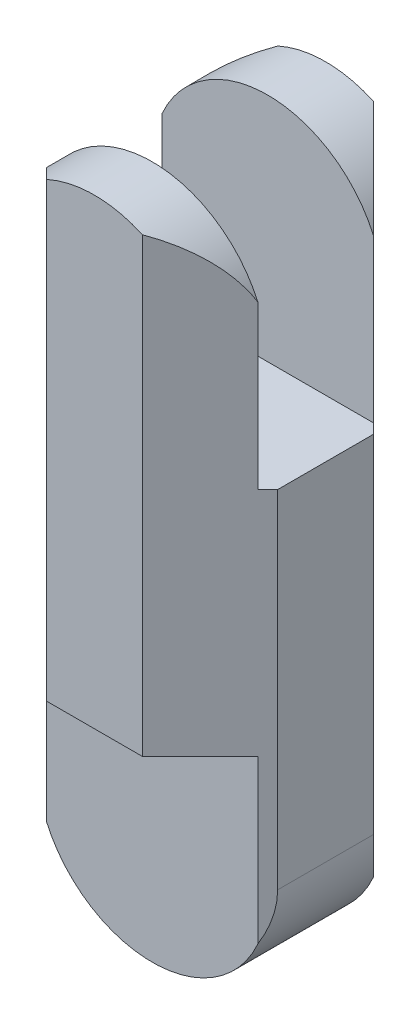
ISO-10303-21;
HEADER;
FILE_DESCRIPTION(('STEP AP214'),'2;1');
FILE_NAME('part.step','',(''),(''),'','','');
FILE_SCHEMA(('AUTOMOTIVE_DESIGN { 1 0 10303 214 1 1 1 1 }'));
ENDSEC;
DATA;
#1=APPLICATION_CONTEXT('core data for automotive mechanical design processes');
#2=APPLICATION_PROTOCOL_DEFINITION('international standard','automotive_design',2000,#1);
#3=PRODUCT_CONTEXT('',#1,'mechanical');
#4=PRODUCT('Part','Part','',(#3));
#5=PRODUCT_RELATED_PRODUCT_CATEGORY('part','',(#4));
#6=PRODUCT_DEFINITION_FORMATION('','',#4);
#7=PRODUCT_DEFINITION_CONTEXT('part definition',#1,'design');
#8=PRODUCT_DEFINITION('design','',#6,#7);
#9=PRODUCT_DEFINITION_SHAPE('','',#8);
#10=(LENGTH_UNIT() NAMED_UNIT(*) SI_UNIT(.MILLI.,.METRE.));
#11=(NAMED_UNIT(*) PLANE_ANGLE_UNIT() SI_UNIT($,.RADIAN.));
#12=(NAMED_UNIT(*) SI_UNIT($,.STERADIAN.) SOLID_ANGLE_UNIT());
#13=UNCERTAINTY_MEASURE_WITH_UNIT(LENGTH_MEASURE(1.E-05),#10,'distance_accuracy_value','');
#14=(GEOMETRIC_REPRESENTATION_CONTEXT(3) GLOBAL_UNCERTAINTY_ASSIGNED_CONTEXT((#13)) GLOBAL_UNIT_ASSIGNED_CONTEXT((#10,
#11,#12)) REPRESENTATION_CONTEXT('',''));
#15=CARTESIAN_POINT('',(0.,0.,0.));
#16=DIRECTION('',(0.,0.,1.));
#17=DIRECTION('',(1.,0.,0.));
#18=AXIS2_PLACEMENT_3D('',#15,#16,#17);
#19=CARTESIAN_POINT('',(4.14213562373094,60.,-10.));
#20=DIRECTION('',(0.,0.,1.));
#21=DIRECTION('',(1.,0.,0.));
#22=AXIS2_PLACEMENT_3D('',#19,#20,#21);
#23=PLANE('',#22);
#24=DIRECTION('',(0.,-1.,0.));
#25=VECTOR('',#24,1.);
#26=CARTESIAN_POINT('',(-4.14213562373096,60.,-10.));
#27=LINE('',#26,#25);
#28=CARTESIAN_POINT('',(-4.14213562373096,59.1017972112445,-10.));
#29=VERTEX_POINT('',#28);
#30=CARTESIAN_POINT('',(-4.14213562373096,20.,-10.));
#31=VERTEX_POINT('',#30);
#32=EDGE_CURVE('E186',#29,#31,#27,.T.);
#33=ORIENTED_EDGE('',*,*,#32,.F.);
#34=CARTESIAN_POINT('',(0.,50.,-10.));
#35=DIRECTION('',(0.,0.,1.));
#36=DIRECTION('',(1.,0.,0.));
#37=AXIS2_PLACEMENT_3D('',#34,#35,#36);
#38=CIRCLE('',#37,10.);
#39=CARTESIAN_POINT('',(4.14213562373094,59.1017972112446,-10.));
#40=VERTEX_POINT('',#39);
#41=EDGE_CURVE('E343',#29,#40,#38,.F.);
#42=ORIENTED_EDGE('',*,*,#41,.T.);
#43=DIRECTION('',(0.,-1.,0.));
#44=VECTOR('',#43,1.);
#45=CARTESIAN_POINT('',(4.14213562373094,60.,-10.));
#46=LINE('',#45,#44);
#47=CARTESIAN_POINT('',(4.14213562373094,20.,-10.));
#48=VERTEX_POINT('',#47);
#49=EDGE_CURVE('E189',#40,#48,#46,.T.);
#50=ORIENTED_EDGE('',*,*,#49,.T.);
#51=DIRECTION('',(1.,0.,0.));
#52=VECTOR('',#51,1.);
#53=CARTESIAN_POINT('',(10.,20.,-10.));
#54=LINE('',#53,#52);
#55=EDGE_CURVE('E261',#31,#48,#54,.T.);
#56=ORIENTED_EDGE('',*,*,#55,.F.);
#57=EDGE_LOOP('',(#33,#42,#50,#56));
#58=FACE_BOUND('',#57,.T.);
#59=ADVANCED_FACE('F39',(#58),#23,.F.);
#60=CARTESIAN_POINT('',(-4.14213562373096,60.,10.));
#61=DIRECTION('',(0.,0.,-1.));
#62=DIRECTION('',(-1.,0.,0.));
#63=AXIS2_PLACEMENT_3D('',#60,#61,#62);
#64=PLANE('',#63);
#65=DIRECTION('',(0.,-1.,0.));
#66=VECTOR('',#65,1.);
#67=CARTESIAN_POINT('',(4.14213562373096,60.,10.));
#68=LINE('',#67,#66);
#69=CARTESIAN_POINT('',(4.14213562373096,59.1017972112445,10.));
#70=VERTEX_POINT('',#69);
#71=CARTESIAN_POINT('',(4.14213562373096,20.,10.));
#72=VERTEX_POINT('',#71);
#73=EDGE_CURVE('E166',#70,#72,#68,.T.);
#74=ORIENTED_EDGE('',*,*,#73,.F.);
#75=CARTESIAN_POINT('',(0.,50.,10.));
#76=DIRECTION('',(0.,0.,-1.));
#77=DIRECTION('',(1.,0.,0.));
#78=AXIS2_PLACEMENT_3D('',#75,#76,#77);
#79=CIRCLE('',#78,10.);
#80=CARTESIAN_POINT('',(-4.14213562373096,59.1017972112445,10.));
#81=VERTEX_POINT('',#80);
#82=EDGE_CURVE('E153',#81,#70,#79,.T.);
#83=ORIENTED_EDGE('',*,*,#82,.F.);
#84=DIRECTION('',(0.,-1.,0.));
#85=VECTOR('',#84,1.);
#86=CARTESIAN_POINT('',(-4.14213562373096,60.,10.));
#87=LINE('',#86,#85);
#88=CARTESIAN_POINT('',(-4.14213562373096,20.,10.));
#89=VERTEX_POINT('',#88);
#90=EDGE_CURVE('E164',#81,#89,#87,.T.);
#91=ORIENTED_EDGE('',*,*,#90,.T.);
#92=DIRECTION('',(-1.,0.,0.));
#93=VECTOR('',#92,1.);
#94=CARTESIAN_POINT('',(-10.,20.,10.));
#95=LINE('',#94,#93);
#96=EDGE_CURVE('E278',#72,#89,#95,.T.);
#97=ORIENTED_EDGE('',*,*,#96,.F.);
#98=EDGE_LOOP('',(#74,#83,#91,#97));
#99=FACE_BOUND('',#98,.T.);
#100=ADVANCED_FACE('F162',(#99),#64,.F.);
#101=CARTESIAN_POINT('',(10.,60.,-4.14213562373095));
#102=DIRECTION('',(-0.707106781186547,0.,0.707106781186548));
#103=DIRECTION('',(0.707106781186548,0.,0.707106781186547));
#104=AXIS2_PLACEMENT_3D('',#101,#102,#103);
#105=PLANE('',#104);
#106=ORIENTED_EDGE('',*,*,#49,.F.);
#107=CARTESIAN_POINT('',(0.,50.,-14.1421356237309));
#108=DIRECTION('',(-0.707106781186547,0.,0.707106781186548));
#109=DIRECTION('',(0.707106781186548,0.,0.707106781186547));
#110=AXIS2_PLACEMENT_3D('',#107,#108,#109);
#111=ELLIPSE('',#110,14.1421356237309,10.);
#112=CARTESIAN_POINT('',(9.14213562373095,54.0523272618718,-5.));
#113=VERTEX_POINT('',#112);
#114=EDGE_CURVE('E339',#40,#113,#111,.F.);
#115=ORIENTED_EDGE('',*,*,#114,.T.);
#116=DIRECTION('',(0.,1.,0.));
#117=VECTOR('',#116,1.);
#118=CARTESIAN_POINT('',(9.14213562373095,60.,-5.));
#119=LINE('',#118,#117);
#120=CARTESIAN_POINT('',(9.14213562373095,40.,-5.));
#121=VERTEX_POINT('',#120);
#122=EDGE_CURVE('E246',#121,#113,#119,.T.);
#123=ORIENTED_EDGE('',*,*,#122,.F.);
#124=DIRECTION('',(0.707106781186548,0.,0.707106781186547));
#125=VECTOR('',#124,1.);
#126=CARTESIAN_POINT('',(10.,40.,-4.14213562373095));
#127=LINE('',#126,#125);
#128=CARTESIAN_POINT('',(10.,40.,-4.14213562373095));
#129=VERTEX_POINT('',#128);
#130=EDGE_CURVE('E258',#121,#129,#127,.T.);
#131=ORIENTED_EDGE('',*,*,#130,.T.);
#132=DIRECTION('',(0.,-1.,0.));
#133=VECTOR('',#132,1.);
#134=CARTESIAN_POINT('',(10.,60.,-4.14213562373095));
#135=LINE('',#134,#133);
#136=CARTESIAN_POINT('',(10.,10.,-4.14213562373095));
#137=VERTEX_POINT('',#136);
#138=EDGE_CURVE('E192',#129,#137,#135,.T.);
#139=ORIENTED_EDGE('',*,*,#138,.T.);
#140=CARTESIAN_POINT('',(0.,10.,-14.1421356237309));
#141=DIRECTION('',(-0.707106781186547,0.,0.707106781186548));
#142=DIRECTION('',(0.707106781186548,0.,0.707106781186547));
#143=AXIS2_PLACEMENT_3D('',#140,#141,#142);
#144=ELLIPSE('',#143,14.1421356237309,10.);
#145=CARTESIAN_POINT('',(9.14213562373095,5.94767273812816,-5.00000000000001));
#146=VERTEX_POINT('',#145);
#147=EDGE_CURVE('E312',#137,#146,#144,.F.);
#148=ORIENTED_EDGE('',*,*,#147,.T.);
#149=DIRECTION('',(0.,-1.,0.));
#150=VECTOR('',#149,1.);
#151=CARTESIAN_POINT('',(9.14213562373095,60.,-5.00000000000001));
#152=LINE('',#151,#150);
#153=CARTESIAN_POINT('',(9.14213562373095,20.,-5.00000000000001));
#154=VERTEX_POINT('',#153);
#155=EDGE_CURVE('E268',#154,#146,#152,.T.);
#156=ORIENTED_EDGE('',*,*,#155,.F.);
#157=DIRECTION('',(-0.707106781186548,0.,-0.707106781186547));
#158=VECTOR('',#157,1.);
#159=CARTESIAN_POINT('',(10.,20.,-4.14213562373095));
#160=LINE('',#159,#158);
#161=EDGE_CURVE('E274',#154,#48,#160,.T.);
#162=ORIENTED_EDGE('',*,*,#161,.T.);
#163=EDGE_LOOP('',(#106,#115,#123,#131,#139,#148,#156,#162));
#164=FACE_BOUND('',#163,.T.);
#165=ADVANCED_FACE('F320',(#164),#105,.F.);
#166=CARTESIAN_POINT('',(-4.14213562373096,60.,-10.));
#167=DIRECTION('',(0.707106781186548,0.,0.707106781186547));
#168=DIRECTION('',(0.707106781186547,0.,-0.707106781186548));
#169=AXIS2_PLACEMENT_3D('',#166,#167,#168);
#170=PLANE('',#169);
#171=DIRECTION('',(0.,-1.,0.));
#172=VECTOR('',#171,1.);
#173=CARTESIAN_POINT('',(-9.14213562373095,60.,-5.));
#174=LINE('',#173,#172);
#175=CARTESIAN_POINT('',(-9.14213562373095,54.0523272618718,-5.));
#176=VERTEX_POINT('',#175);
#177=CARTESIAN_POINT('',(-9.14213562373095,40.,-5.));
#178=VERTEX_POINT('',#177);
#179=EDGE_CURVE('E243',#176,#178,#174,.T.);
#180=ORIENTED_EDGE('',*,*,#179,.F.);
#181=CARTESIAN_POINT('',(0.,50.,-14.142135623731));
#182=DIRECTION('',(0.707106781186548,0.,0.707106781186547));
#183=DIRECTION('',(-0.707106781186547,0.,0.707106781186548));
#184=AXIS2_PLACEMENT_3D('',#181,#182,#183);
#185=ELLIPSE('',#184,14.142135623731,10.);
#186=EDGE_CURVE('E350',#176,#29,#185,.F.);
#187=ORIENTED_EDGE('',*,*,#186,.T.);
#188=ORIENTED_EDGE('',*,*,#32,.T.);
#189=DIRECTION('',(-0.707106781186547,0.,0.707106781186548));
#190=VECTOR('',#189,1.);
#191=CARTESIAN_POINT('',(-4.14213562373096,20.,-10.));
#192=LINE('',#191,#190);
#193=CARTESIAN_POINT('',(-9.14213562373096,20.,-5.));
#194=VERTEX_POINT('',#193);
#195=EDGE_CURVE('E205',#31,#194,#192,.T.);
#196=ORIENTED_EDGE('',*,*,#195,.T.);
#197=DIRECTION('',(0.,1.,0.));
#198=VECTOR('',#197,1.);
#199=CARTESIAN_POINT('',(-9.14213562373096,60.,-5.));
#200=LINE('',#199,#198);
#201=CARTESIAN_POINT('',(-9.14213562373096,5.94767273812821,-5.));
#202=VERTEX_POINT('',#201);
#203=EDGE_CURVE('E202',#202,#194,#200,.T.);
#204=ORIENTED_EDGE('',*,*,#203,.F.);
#205=CARTESIAN_POINT('',(0.,10.,-14.142135623731));
#206=DIRECTION('',(0.707106781186548,0.,0.707106781186547));
#207=DIRECTION('',(-0.707106781186547,0.,0.707106781186548));
#208=AXIS2_PLACEMENT_3D('',#205,#206,#207);
#209=ELLIPSE('',#208,14.142135623731,10.);
#210=CARTESIAN_POINT('',(-10.,10.,-4.14213562373095));
#211=VERTEX_POINT('',#210);
#212=EDGE_CURVE('E298',#202,#211,#209,.F.);
#213=ORIENTED_EDGE('',*,*,#212,.T.);
#214=DIRECTION('',(0.,-1.,0.));
#215=VECTOR('',#214,1.);
#216=CARTESIAN_POINT('',(-10.,60.,-4.14213562373095));
#217=LINE('',#216,#215);
#218=CARTESIAN_POINT('',(-10.,40.,-4.14213562373096));
#219=VERTEX_POINT('',#218);
#220=EDGE_CURVE('E178',#219,#211,#217,.T.);
#221=ORIENTED_EDGE('',*,*,#220,.F.);
#222=DIRECTION('',(0.707106781186547,0.,-0.707106781186548));
#223=VECTOR('',#222,1.);
#224=CARTESIAN_POINT('',(-4.14213562373096,40.,-10.));
#225=LINE('',#224,#223);
#226=EDGE_CURVE('E254',#219,#178,#225,.T.);
#227=ORIENTED_EDGE('',*,*,#226,.T.);
#228=EDGE_LOOP('',(#180,#187,#188,#196,#204,#213,#221,#227));
#229=FACE_BOUND('',#228,.T.);
#230=ADVANCED_FACE('F330',(#229),#170,.F.);
#231=CARTESIAN_POINT('',(0.,0.,-5.));
#232=DIRECTION('',(0.,0.,1.));
#233=DIRECTION('',(1.,0.,0.));
#234=AXIS2_PLACEMENT_3D('',#231,#232,#233);
#235=PLANE('',#234);
#236=CARTESIAN_POINT('',(0.,50.,-5.));
#237=DIRECTION('',(0.,0.,1.));
#238=DIRECTION('',(1.,0.,0.));
#239=AXIS2_PLACEMENT_3D('',#236,#237,#238);
#240=CIRCLE('',#239,10.);
#241=EDGE_CURVE('E158',#176,#113,#240,.F.);
#242=ORIENTED_EDGE('',*,*,#241,.F.);
#243=ORIENTED_EDGE('',*,*,#179,.T.);
#244=DIRECTION('',(1.,0.,0.));
#245=VECTOR('',#244,1.);
#246=CARTESIAN_POINT('',(-10.,40.,-5.));
#247=LINE('',#246,#245);
#248=EDGE_CURVE('E236',#178,#121,#247,.T.);
#249=ORIENTED_EDGE('',*,*,#248,.T.);
#250=ORIENTED_EDGE('',*,*,#122,.T.);
#251=EDGE_LOOP('',(#242,#243,#249,#250));
#252=FACE_BOUND('',#251,.T.);
#253=ADVANCED_FACE('F357',(#252),#235,.T.);
#254=CARTESIAN_POINT('',(0.,0.,5.));
#255=DIRECTION('',(0.,0.,1.));
#256=DIRECTION('',(1.,0.,0.));
#257=AXIS2_PLACEMENT_3D('',#254,#255,#256);
#258=PLANE('',#257);
#259=DIRECTION('',(0.,-1.,0.));
#260=VECTOR('',#259,1.);
#261=CARTESIAN_POINT('',(-9.14213562373096,60.,5.));
#262=LINE('',#261,#260);
#263=CARTESIAN_POINT('',(-9.14213562373096,54.0523272618718,5.));
#264=VERTEX_POINT('',#263);
#265=CARTESIAN_POINT('',(-9.14213562373096,40.,5.));
#266=VERTEX_POINT('',#265);
#267=EDGE_CURVE('E234',#264,#266,#262,.T.);
#268=ORIENTED_EDGE('',*,*,#267,.F.);
#269=CARTESIAN_POINT('',(0.,50.,5.));
#270=DIRECTION('',(0.,0.,1.));
#271=DIRECTION('',(1.,0.,0.));
#272=AXIS2_PLACEMENT_3D('',#269,#270,#271);
#273=CIRCLE('',#272,10.);
#274=CARTESIAN_POINT('',(9.14213562373096,54.0523272618718,5.));
#275=VERTEX_POINT('',#274);
#276=EDGE_CURVE('E11',#264,#275,#273,.F.);
#277=ORIENTED_EDGE('',*,*,#276,.T.);
#278=DIRECTION('',(0.,1.,0.));
#279=VECTOR('',#278,1.);
#280=CARTESIAN_POINT('',(9.14213562373096,60.,5.));
#281=LINE('',#280,#279);
#282=CARTESIAN_POINT('',(9.14213562373096,40.,5.));
#283=VERTEX_POINT('',#282);
#284=EDGE_CURVE('E214',#283,#275,#281,.T.);
#285=ORIENTED_EDGE('',*,*,#284,.F.);
#286=DIRECTION('',(1.,0.,0.));
#287=VECTOR('',#286,1.);
#288=CARTESIAN_POINT('',(-10.,40.,5.));
#289=LINE('',#288,#287);
#290=EDGE_CURVE('E225',#266,#283,#289,.T.);
#291=ORIENTED_EDGE('',*,*,#290,.F.);
#292=EDGE_LOOP('',(#268,#277,#285,#291));
#293=FACE_BOUND('',#292,.T.);
#294=ADVANCED_FACE('F376',(#293),#258,.F.);
#295=CARTESIAN_POINT('',(0.,10.,-56.));
#296=DIRECTION('',(0.,0.,1.));
#297=DIRECTION('',(1.,0.,0.));
#298=AXIS2_PLACEMENT_3D('',#295,#296,#297);
#299=CYLINDRICAL_SURFACE('',#298,10.);
#300=CARTESIAN_POINT('',(0.,10.,-5.));
#301=DIRECTION('',(0.,0.,-1.));
#302=DIRECTION('',(-1.,0.,0.));
#303=AXIS2_PLACEMENT_3D('',#300,#301,#302);
#304=CIRCLE('',#303,10.);
#305=EDGE_CURVE('E62',#146,#202,#304,.T.);
#306=ORIENTED_EDGE('',*,*,#305,.F.);
#307=ORIENTED_EDGE('',*,*,#147,.F.);
#308=DIRECTION('',(0.,0.,1.));
#309=VECTOR('',#308,1.);
#310=CARTESIAN_POINT('',(10.,10.,-56.));
#311=LINE('',#310,#309);
#312=CARTESIAN_POINT('',(10.,9.99999999999999,4.14213562373095));
#313=VERTEX_POINT('',#312);
#314=EDGE_CURVE('E294',#137,#313,#311,.T.);
#315=ORIENTED_EDGE('',*,*,#314,.T.);
#316=CARTESIAN_POINT('',(0.,10.,14.1421356237309));
#317=DIRECTION('',(-0.707106781186547,0.,-0.707106781186548));
#318=DIRECTION('',(-0.707106781186548,0.,0.707106781186547));
#319=AXIS2_PLACEMENT_3D('',#316,#317,#318);
#320=ELLIPSE('',#319,14.1421356237309,10.);
#321=CARTESIAN_POINT('',(9.14213562373095,5.94767273812818,5.));
#322=VERTEX_POINT('',#321);
#323=EDGE_CURVE('E305',#322,#313,#320,.F.);
#324=ORIENTED_EDGE('',*,*,#323,.F.);
#325=CARTESIAN_POINT('',(0.,10.,5.));
#326=DIRECTION('',(0.,0.,1.));
#327=DIRECTION('',(1.,0.,0.));
#328=AXIS2_PLACEMENT_3D('',#325,#326,#327);
#329=CIRCLE('',#328,10.);
#330=CARTESIAN_POINT('',(-9.14213562373095,5.94767273812819,5.00000000000001));
#331=VERTEX_POINT('',#330);
#332=EDGE_CURVE('E195',#331,#322,#329,.T.);
#333=ORIENTED_EDGE('',*,*,#332,.F.);
#334=CARTESIAN_POINT('',(0.,10.,14.142135623731));
#335=DIRECTION('',(0.707106781186548,0.,-0.707106781186547));
#336=DIRECTION('',(0.707106781186547,0.,0.707106781186548));
#337=AXIS2_PLACEMENT_3D('',#334,#335,#336);
#338=ELLIPSE('',#337,14.142135623731,10.);
#339=CARTESIAN_POINT('',(-10.,10.,4.14213562373096));
#340=VERTEX_POINT('',#339);
#341=EDGE_CURVE('E308',#340,#331,#338,.F.);
#342=ORIENTED_EDGE('',*,*,#341,.F.);
#343=DIRECTION('',(0.,0.,1.));
#344=VECTOR('',#343,1.);
#345=CARTESIAN_POINT('',(-10.,10.,-56.));
#346=LINE('',#345,#344);
#347=EDGE_CURVE('E293',#211,#340,#346,.T.);
#348=ORIENTED_EDGE('',*,*,#347,.F.);
#349=ORIENTED_EDGE('',*,*,#212,.F.);
#350=EDGE_LOOP('',(#306,#307,#315,#324,#333,#342,#348,#349));
#351=FACE_BOUND('',#350,.T.);
#352=ADVANCED_FACE('F322',(#351),#299,.T.);
#353=CARTESIAN_POINT('',(-10.,60.,-4.14213562373095));
#354=DIRECTION('',(1.,0.,0.));
#355=DIRECTION('',(0.,0.,-1.));
#356=AXIS2_PLACEMENT_3D('',#353,#354,#355);
#357=PLANE('',#356);
#358=DIRECTION('',(0.,-1.,0.));
#359=VECTOR('',#358,1.);
#360=CARTESIAN_POINT('',(-10.,60.,4.14213562373096));
#361=LINE('',#360,#359);
#362=CARTESIAN_POINT('',(-10.,40.,4.14213562373096));
#363=VERTEX_POINT('',#362);
#364=EDGE_CURVE('E174',#363,#340,#361,.T.);
#365=ORIENTED_EDGE('',*,*,#364,.F.);
#366=DIRECTION('',(0.,0.,1.));
#367=VECTOR('',#366,1.);
#368=CARTESIAN_POINT('',(-10.,40.,-5.));
#369=LINE('',#368,#367);
#370=EDGE_CURVE('E230',#219,#363,#369,.T.);
#371=ORIENTED_EDGE('',*,*,#370,.F.);
#372=ORIENTED_EDGE('',*,*,#220,.T.);
#373=ORIENTED_EDGE('',*,*,#347,.T.);
#374=EDGE_LOOP('',(#365,#371,#372,#373));
#375=FACE_BOUND('',#374,.T.);
#376=ADVANCED_FACE('F374',(#375),#357,.F.);
#377=CARTESIAN_POINT('',(10.,60.,4.14213562373095));
#378=DIRECTION('',(-1.,0.,0.));
#379=DIRECTION('',(0.,0.,1.));
#380=AXIS2_PLACEMENT_3D('',#377,#378,#379);
#381=PLANE('',#380);
#382=ORIENTED_EDGE('',*,*,#138,.F.);
#383=DIRECTION('',(0.,0.,1.));
#384=VECTOR('',#383,1.);
#385=CARTESIAN_POINT('',(10.,40.,-5.));
#386=LINE('',#385,#384);
#387=CARTESIAN_POINT('',(10.,40.,4.14213562373096));
#388=VERTEX_POINT('',#387);
#389=EDGE_CURVE('E221',#129,#388,#386,.T.);
#390=ORIENTED_EDGE('',*,*,#389,.T.);
#391=DIRECTION('',(0.,-1.,0.));
#392=VECTOR('',#391,1.);
#393=CARTESIAN_POINT('',(10.,60.,4.14213562373095));
#394=LINE('',#393,#392);
#395=EDGE_CURVE('E180',#388,#313,#394,.T.);
#396=ORIENTED_EDGE('',*,*,#395,.T.);
#397=ORIENTED_EDGE('',*,*,#314,.F.);
#398=EDGE_LOOP('',(#382,#390,#396,#397));
#399=FACE_BOUND('',#398,.T.);
#400=ADVANCED_FACE('F41',(#399),#381,.F.);
#401=CARTESIAN_POINT('',(-10.,60.,4.14213562373096));
#402=DIRECTION('',(0.707106781186548,0.,-0.707106781186547));
#403=DIRECTION('',(-0.707106781186547,0.,-0.707106781186548));
#404=AXIS2_PLACEMENT_3D('',#401,#402,#403);
#405=PLANE('',#404);
#406=ORIENTED_EDGE('',*,*,#90,.F.);
#407=CARTESIAN_POINT('',(0.,50.,14.142135623731));
#408=DIRECTION('',(0.707106781186548,0.,-0.707106781186547));
#409=DIRECTION('',(0.707106781186547,0.,0.707106781186548));
#410=AXIS2_PLACEMENT_3D('',#407,#408,#409);
#411=ELLIPSE('',#410,14.142135623731,10.);
#412=EDGE_CURVE('E150',#81,#264,#411,.F.);
#413=ORIENTED_EDGE('',*,*,#412,.T.);
#414=ORIENTED_EDGE('',*,*,#267,.T.);
#415=DIRECTION('',(-0.707106781186547,0.,-0.707106781186548));
#416=VECTOR('',#415,1.);
#417=CARTESIAN_POINT('',(-10.,40.,4.14213562373096));
#418=LINE('',#417,#416);
#419=EDGE_CURVE('E250',#266,#363,#418,.T.);
#420=ORIENTED_EDGE('',*,*,#419,.T.);
#421=ORIENTED_EDGE('',*,*,#364,.T.);
#422=ORIENTED_EDGE('',*,*,#341,.T.);
#423=DIRECTION('',(0.,-1.,0.));
#424=VECTOR('',#423,1.);
#425=CARTESIAN_POINT('',(-9.14213562373095,60.,5.));
#426=LINE('',#425,#424);
#427=CARTESIAN_POINT('',(-9.14213562373095,20.,5.));
#428=VERTEX_POINT('',#427);
#429=EDGE_CURVE('E288',#428,#331,#426,.T.);
#430=ORIENTED_EDGE('',*,*,#429,.F.);
#431=DIRECTION('',(0.707106781186547,0.,0.707106781186548));
#432=VECTOR('',#431,1.);
#433=CARTESIAN_POINT('',(-10.,20.,4.14213562373096));
#434=LINE('',#433,#432);
#435=EDGE_CURVE('E172',#428,#89,#434,.T.);
#436=ORIENTED_EDGE('',*,*,#435,.T.);
#437=EDGE_LOOP('',(#406,#413,#414,#420,#421,#422,#430,#436));
#438=FACE_BOUND('',#437,.T.);
#439=ADVANCED_FACE('F170',(#438),#405,.F.);
#440=CARTESIAN_POINT('',(4.14213562373096,60.,10.));
#441=DIRECTION('',(-0.707106781186547,0.,-0.707106781186548));
#442=DIRECTION('',(-0.707106781186548,0.,0.707106781186547));
#443=AXIS2_PLACEMENT_3D('',#440,#441,#442);
#444=PLANE('',#443);
#445=ORIENTED_EDGE('',*,*,#284,.T.);
#446=CARTESIAN_POINT('',(0.,50.,14.1421356237309));
#447=DIRECTION('',(-0.707106781186547,0.,-0.707106781186548));
#448=DIRECTION('',(-0.707106781186548,0.,0.707106781186547));
#449=AXIS2_PLACEMENT_3D('',#446,#447,#448);
#450=ELLIPSE('',#449,14.1421356237309,10.);
#451=EDGE_CURVE('E55',#275,#70,#450,.F.);
#452=ORIENTED_EDGE('',*,*,#451,.T.);
#453=ORIENTED_EDGE('',*,*,#73,.T.);
#454=DIRECTION('',(0.707106781186548,0.,-0.707106781186547));
#455=VECTOR('',#454,1.);
#456=CARTESIAN_POINT('',(4.14213562373096,20.,10.));
#457=LINE('',#456,#455);
#458=CARTESIAN_POINT('',(9.14213562373096,20.,5.));
#459=VERTEX_POINT('',#458);
#460=EDGE_CURVE('E198',#72,#459,#457,.T.);
#461=ORIENTED_EDGE('',*,*,#460,.T.);
#462=DIRECTION('',(0.,1.,0.));
#463=VECTOR('',#462,1.);
#464=CARTESIAN_POINT('',(9.14213562373095,60.,5.));
#465=LINE('',#464,#463);
#466=EDGE_CURVE('E283',#322,#459,#465,.T.);
#467=ORIENTED_EDGE('',*,*,#466,.F.);
#468=ORIENTED_EDGE('',*,*,#323,.T.);
#469=ORIENTED_EDGE('',*,*,#395,.F.);
#470=DIRECTION('',(-0.707106781186548,0.,0.707106781186547));
#471=VECTOR('',#470,1.);
#472=CARTESIAN_POINT('',(4.14213562373096,40.,10.));
#473=LINE('',#472,#471);
#474=EDGE_CURVE('E48',#388,#283,#473,.T.);
#475=ORIENTED_EDGE('',*,*,#474,.T.);
#476=EDGE_LOOP('',(#445,#452,#453,#461,#467,#468,#469,#475));
#477=FACE_BOUND('',#476,.T.);
#478=ADVANCED_FACE('F213',(#477),#444,.F.);
#479=CARTESIAN_POINT('',(-10.,20.,5.));
#480=DIRECTION('',(0.,1.,0.));
#481=DIRECTION('',(0.,0.,1.));
#482=AXIS2_PLACEMENT_3D('',#479,#480,#481);
#483=PLANE('',#482);
#484=DIRECTION('',(-1.,0.,0.));
#485=VECTOR('',#484,1.);
#486=CARTESIAN_POINT('',(-10.,20.,5.));
#487=LINE('',#486,#485);
#488=EDGE_CURVE('E279',#459,#428,#487,.T.);
#489=ORIENTED_EDGE('',*,*,#488,.F.);
#490=ORIENTED_EDGE('',*,*,#460,.F.);
#491=ORIENTED_EDGE('',*,*,#96,.T.);
#492=ORIENTED_EDGE('',*,*,#435,.F.);
#493=EDGE_LOOP('',(#489,#490,#491,#492));
#494=FACE_BOUND('',#493,.T.);
#495=ADVANCED_FACE('F368',(#494),#483,.F.);
#496=CARTESIAN_POINT('',(0.,10.,5.));
#497=DIRECTION('',(0.,0.,1.));
#498=DIRECTION('',(1.,0.,0.));
#499=AXIS2_PLACEMENT_3D('',#496,#497,#498);
#500=PLANE('',#499);
#501=ORIENTED_EDGE('',*,*,#429,.T.);
#502=ORIENTED_EDGE('',*,*,#332,.T.);
#503=ORIENTED_EDGE('',*,*,#466,.T.);
#504=ORIENTED_EDGE('',*,*,#488,.T.);
#505=EDGE_LOOP('',(#501,#502,#503,#504));
#506=FACE_BOUND('',#505,.T.);
#507=ADVANCED_FACE('F370',(#506),#500,.T.);
#508=CARTESIAN_POINT('',(10.,20.,-5.00000000000001));
#509=DIRECTION('',(0.,1.,0.));
#510=DIRECTION('',(0.,0.,1.));
#511=AXIS2_PLACEMENT_3D('',#508,#509,#510);
#512=PLANE('',#511);
#513=DIRECTION('',(1.,0.,0.));
#514=VECTOR('',#513,1.);
#515=CARTESIAN_POINT('',(10.,20.,-5.00000000000001));
#516=LINE('',#515,#514);
#517=EDGE_CURVE('E264',#194,#154,#516,.T.);
#518=ORIENTED_EDGE('',*,*,#517,.F.);
#519=ORIENTED_EDGE('',*,*,#195,.F.);
#520=ORIENTED_EDGE('',*,*,#55,.T.);
#521=ORIENTED_EDGE('',*,*,#161,.F.);
#522=EDGE_LOOP('',(#518,#519,#520,#521));
#523=FACE_BOUND('',#522,.T.);
#524=ADVANCED_FACE('F335',(#523),#512,.F.);
#525=CARTESIAN_POINT('',(0.,10.,-5.));
#526=DIRECTION('',(0.,0.,-1.));
#527=DIRECTION('',(-1.,0.,0.));
#528=AXIS2_PLACEMENT_3D('',#525,#526,#527);
#529=PLANE('',#528);
#530=ORIENTED_EDGE('',*,*,#155,.T.);
#531=ORIENTED_EDGE('',*,*,#305,.T.);
#532=ORIENTED_EDGE('',*,*,#203,.T.);
#533=ORIENTED_EDGE('',*,*,#517,.T.);
#534=EDGE_LOOP('',(#530,#531,#532,#533));
#535=FACE_BOUND('',#534,.T.);
#536=ADVANCED_FACE('F333',(#535),#529,.T.);
#537=CARTESIAN_POINT('',(-10.,40.,-5.));
#538=DIRECTION('',(0.,-1.,0.));
#539=DIRECTION('',(0.,0.,-1.));
#540=AXIS2_PLACEMENT_3D('',#537,#538,#539);
#541=PLANE('',#540);
#542=ORIENTED_EDGE('',*,*,#248,.F.);
#543=ORIENTED_EDGE('',*,*,#226,.F.);
#544=ORIENTED_EDGE('',*,*,#370,.T.);
#545=ORIENTED_EDGE('',*,*,#419,.F.);
#546=ORIENTED_EDGE('',*,*,#290,.T.);
#547=ORIENTED_EDGE('',*,*,#474,.F.);
#548=ORIENTED_EDGE('',*,*,#389,.F.);
#549=ORIENTED_EDGE('',*,*,#130,.F.);
#550=EDGE_LOOP('',(#542,#543,#544,#545,#546,#547,#548,#549));
#551=FACE_BOUND('',#550,.T.);
#552=ADVANCED_FACE('F220',(#551),#541,.F.);
#553=CARTESIAN_POINT('',(0.,50.,-20.));
#554=DIRECTION('',(0.,0.,1.));
#555=DIRECTION('',(1.,0.,0.));
#556=AXIS2_PLACEMENT_3D('',#553,#554,#555);
#557=CYLINDRICAL_SURFACE('',#556,10.);
#558=ORIENTED_EDGE('',*,*,#82,.T.);
#559=ORIENTED_EDGE('',*,*,#451,.F.);
#560=ORIENTED_EDGE('',*,*,#276,.F.);
#561=ORIENTED_EDGE('',*,*,#412,.F.);
#562=EDGE_LOOP('',(#558,#559,#560,#561));
#563=FACE_BOUND('',#562,.T.);
#564=ADVANCED_FACE('F152',(#563),#557,.T.);
#565=ORIENTED_EDGE('',*,*,#241,.T.);
#566=ORIENTED_EDGE('',*,*,#114,.F.);
#567=ORIENTED_EDGE('',*,*,#41,.F.);
#568=ORIENTED_EDGE('',*,*,#186,.F.);
#569=EDGE_LOOP('',(#565,#566,#567,#568));
#570=FACE_BOUND('',#569,.T.);
#571=ADVANCED_FACE('F438',(#570),#557,.T.);
#572=CLOSED_SHELL('',(#59,#100,#165,#230,#253,#294,#352,#376,#400,#439,#478,#495,#507,#524,#536,
#552,#564,#571));
#573=MANIFOLD_SOLID_BREP('B2',#572);
#574=ADVANCED_BREP_SHAPE_REPRESENTATION('',(#18,#573),#14);
#575=SHAPE_DEFINITION_REPRESENTATION(#9,#574);
ENDSEC;
END-ISO-10303-21;
